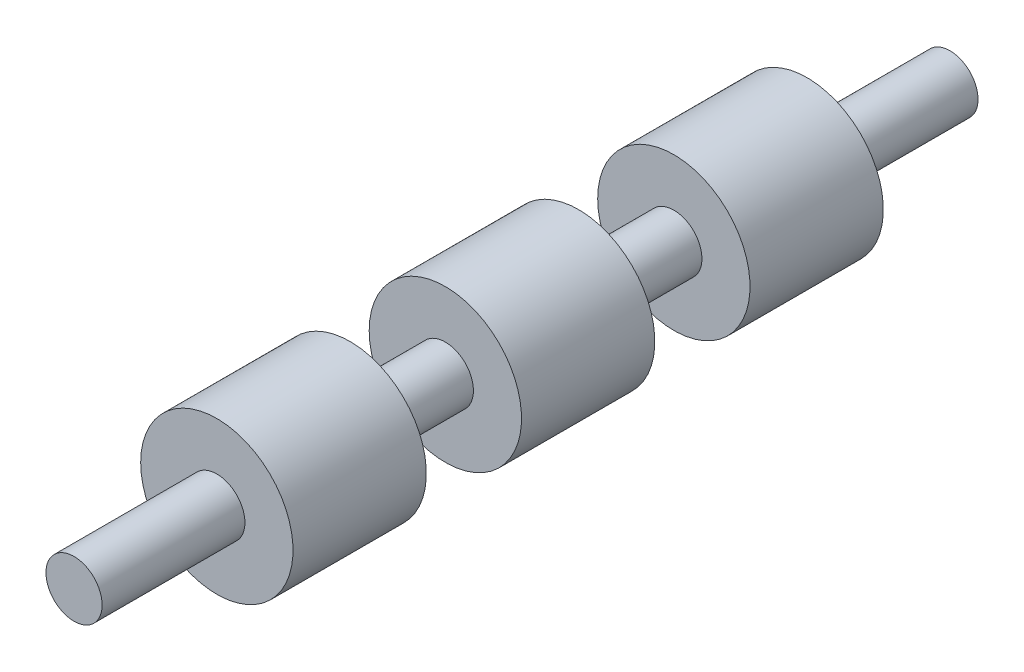
ISO-10303-21;
HEADER;
FILE_DESCRIPTION(('STEP AP214'),'2;1');
FILE_NAME('part.step','',(''),(''),'','','');
FILE_SCHEMA(('AUTOMOTIVE_DESIGN { 1 0 10303 214 1 1 1 1 }'));
ENDSEC;
DATA;
#1=APPLICATION_CONTEXT('core data for automotive mechanical design processes');
#2=APPLICATION_PROTOCOL_DEFINITION('international standard','automotive_design',2000,#1);
#3=PRODUCT_CONTEXT('',#1,'mechanical');
#4=PRODUCT('Part','Part','',(#3));
#5=PRODUCT_RELATED_PRODUCT_CATEGORY('part','',(#4));
#6=PRODUCT_DEFINITION_FORMATION('','',#4);
#7=PRODUCT_DEFINITION_CONTEXT('part definition',#1,'design');
#8=PRODUCT_DEFINITION('design','',#6,#7);
#9=PRODUCT_DEFINITION_SHAPE('','',#8);
#10=(LENGTH_UNIT() NAMED_UNIT(*) SI_UNIT(.MILLI.,.METRE.));
#11=(NAMED_UNIT(*) PLANE_ANGLE_UNIT() SI_UNIT($,.RADIAN.));
#12=(NAMED_UNIT(*) SI_UNIT($,.STERADIAN.) SOLID_ANGLE_UNIT());
#13=UNCERTAINTY_MEASURE_WITH_UNIT(LENGTH_MEASURE(1.E-05),#10,'distance_accuracy_value','');
#14=(GEOMETRIC_REPRESENTATION_CONTEXT(3) GLOBAL_UNCERTAINTY_ASSIGNED_CONTEXT((#13)) GLOBAL_UNIT_ASSIGNED_CONTEXT((#10,
#11,#12)) REPRESENTATION_CONTEXT('',''));
#15=CARTESIAN_POINT('',(0.,0.,0.));
#16=DIRECTION('',(0.,0.,1.));
#17=DIRECTION('',(1.,0.,0.));
#18=AXIS2_PLACEMENT_3D('',#15,#16,#17);
#19=CARTESIAN_POINT('',(0.,0.,15.));
#20=DIRECTION('',(0.,0.,-1.));
#21=DIRECTION('',(-1.,0.,0.));
#22=AXIS2_PLACEMENT_3D('',#19,#20,#21);
#23=CYLINDRICAL_SURFACE('',#22,2.95);
#24=CARTESIAN_POINT('',(0.,0.,15.));
#25=DIRECTION('',(0.,0.,1.));
#26=DIRECTION('',(1.,0.,0.));
#27=AXIS2_PLACEMENT_3D('',#24,#25,#26);
#28=CIRCLE('',#27,2.95);
#29=CARTESIAN_POINT('',(2.95,0.,15.));
#30=VERTEX_POINT('',#29);
#31=EDGE_CURVE('E70',#30,#30,#28,.T.);
#32=ORIENTED_EDGE('',*,*,#31,.F.);
#33=EDGE_LOOP('',(#32));
#34=FACE_BOUND('',#33,.T.);
#35=CARTESIAN_POINT('',(0.,0.,0.));
#36=DIRECTION('',(0.,0.,1.));
#37=DIRECTION('',(1.,0.,0.));
#38=AXIS2_PLACEMENT_3D('',#35,#36,#37);
#39=CIRCLE('',#38,2.95);
#40=CARTESIAN_POINT('',(2.95,0.,0.));
#41=VERTEX_POINT('',#40);
#42=EDGE_CURVE('E35',#41,#41,#39,.T.);
#43=ORIENTED_EDGE('',*,*,#42,.T.);
#44=EDGE_LOOP('',(#43));
#45=FACE_BOUND('',#44,.T.);
#46=ADVANCED_FACE('F32',(#34,#45),#23,.T.);
#47=CARTESIAN_POINT('',(0.,0.,15.));
#48=DIRECTION('',(0.,0.,1.));
#49=DIRECTION('',(1.,0.,0.));
#50=AXIS2_PLACEMENT_3D('',#47,#48,#49);
#51=PLANE('',#50);
#52=ORIENTED_EDGE('',*,*,#31,.T.);
#53=EDGE_LOOP('',(#52));
#54=FACE_BOUND('',#53,.T.);
#55=ADVANCED_FACE('F92',(#54),#51,.T.);
#56=CARTESIAN_POINT('',(0.,0.,-14.));
#57=DIRECTION('',(0.,0.,1.));
#58=DIRECTION('',(1.,0.,0.));
#59=AXIS2_PLACEMENT_3D('',#56,#57,#58);
#60=CYLINDRICAL_SURFACE('',#59,8.);
#61=CARTESIAN_POINT('',(0.,0.,-14.));
#62=DIRECTION('',(0.,0.,-1.));
#63=DIRECTION('',(-1.,0.,0.));
#64=AXIS2_PLACEMENT_3D('',#61,#62,#63);
#65=CIRCLE('',#64,8.);
#66=CARTESIAN_POINT('',(-8.,0.,-14.));
#67=VERTEX_POINT('',#66);
#68=EDGE_CURVE('E71',#67,#67,#65,.T.);
#69=ORIENTED_EDGE('',*,*,#68,.F.);
#70=EDGE_LOOP('',(#69));
#71=FACE_BOUND('',#70,.T.);
#72=CARTESIAN_POINT('',(0.,0.,0.));
#73=DIRECTION('',(0.,0.,-1.));
#74=DIRECTION('',(-1.,0.,0.));
#75=AXIS2_PLACEMENT_3D('',#72,#73,#74);
#76=CIRCLE('',#75,8.);
#77=CARTESIAN_POINT('',(-8.,0.,0.));
#78=VERTEX_POINT('',#77);
#79=EDGE_CURVE('E67',#78,#78,#76,.T.);
#80=ORIENTED_EDGE('',*,*,#79,.T.);
#81=EDGE_LOOP('',(#80));
#82=FACE_BOUND('',#81,.T.);
#83=ADVANCED_FACE('F90',(#71,#82),#60,.T.);
#84=CARTESIAN_POINT('',(0.,0.,-14.));
#85=DIRECTION('',(0.,0.,-1.));
#86=DIRECTION('',(-1.,0.,0.));
#87=AXIS2_PLACEMENT_3D('',#84,#85,#86);
#88=PLANE('',#87);
#89=CARTESIAN_POINT('',(0.,0.,-14.));
#90=DIRECTION('',(0.,0.,-1.));
#91=DIRECTION('',(-1.,0.,0.));
#92=AXIS2_PLACEMENT_3D('',#89,#90,#91);
#93=CIRCLE('',#92,2.95);
#94=CARTESIAN_POINT('',(-2.95,0.,-14.));
#95=VERTEX_POINT('',#94);
#96=EDGE_CURVE('E44',#95,#95,#93,.T.);
#97=ORIENTED_EDGE('',*,*,#96,.F.);
#98=EDGE_LOOP('',(#97));
#99=FACE_BOUND('',#98,.T.);
#100=ORIENTED_EDGE('',*,*,#68,.T.);
#101=EDGE_LOOP('',(#100));
#102=FACE_BOUND('',#101,.T.);
#103=ADVANCED_FACE('F86',(#99,#102),#88,.T.);
#104=CARTESIAN_POINT('',(0.,0.,0.));
#105=DIRECTION('',(0.,0.,-1.));
#106=DIRECTION('',(-1.,0.,0.));
#107=AXIS2_PLACEMENT_3D('',#104,#105,#106);
#108=PLANE('',#107);
#109=ORIENTED_EDGE('',*,*,#42,.F.);
#110=EDGE_LOOP('',(#109));
#111=FACE_BOUND('',#110,.T.);
#112=ORIENTED_EDGE('',*,*,#79,.F.);
#113=EDGE_LOOP('',(#112));
#114=FACE_BOUND('',#113,.T.);
#115=ADVANCED_FACE('F82',(#111,#114),#108,.F.);
#116=CARTESIAN_POINT('',(0.,0.,-24.));
#117=DIRECTION('',(0.,0.,1.));
#118=DIRECTION('',(1.,0.,0.));
#119=AXIS2_PLACEMENT_3D('',#116,#117,#118);
#120=CYLINDRICAL_SURFACE('',#119,2.95);
#121=CARTESIAN_POINT('',(0.,0.,-24.));
#122=DIRECTION('',(0.,0.,-1.));
#123=DIRECTION('',(-1.,0.,0.));
#124=AXIS2_PLACEMENT_3D('',#121,#122,#123);
#125=CIRCLE('',#124,2.95);
#126=CARTESIAN_POINT('',(-2.95,0.,-24.));
#127=VERTEX_POINT('',#126);
#128=EDGE_CURVE('E62',#127,#127,#125,.T.);
#129=ORIENTED_EDGE('',*,*,#128,.F.);
#130=EDGE_LOOP('',(#129));
#131=FACE_BOUND('',#130,.T.);
#132=ORIENTED_EDGE('',*,*,#96,.T.);
#133=EDGE_LOOP('',(#132));
#134=FACE_BOUND('',#133,.T.);
#135=ADVANCED_FACE('F85',(#131,#134),#120,.T.);
#136=CARTESIAN_POINT('',(0.,0.,-38.));
#137=DIRECTION('',(0.,0.,1.));
#138=DIRECTION('',(1.,0.,0.));
#139=AXIS2_PLACEMENT_3D('',#136,#137,#138);
#140=CYLINDRICAL_SURFACE('',#139,8.);
#141=CARTESIAN_POINT('',(0.,0.,-38.));
#142=DIRECTION('',(0.,0.,-1.));
#143=DIRECTION('',(-1.,0.,0.));
#144=AXIS2_PLACEMENT_3D('',#141,#142,#143);
#145=CIRCLE('',#144,8.);
#146=CARTESIAN_POINT('',(-8.,0.,-38.));
#147=VERTEX_POINT('',#146);
#148=EDGE_CURVE('E59',#147,#147,#145,.T.);
#149=ORIENTED_EDGE('',*,*,#148,.F.);
#150=EDGE_LOOP('',(#149));
#151=FACE_BOUND('',#150,.T.);
#152=CARTESIAN_POINT('',(0.,0.,-24.));
#153=DIRECTION('',(0.,0.,-1.));
#154=DIRECTION('',(-1.,0.,0.));
#155=AXIS2_PLACEMENT_3D('',#152,#153,#154);
#156=CIRCLE('',#155,8.);
#157=CARTESIAN_POINT('',(-8.,0.,-24.));
#158=VERTEX_POINT('',#157);
#159=EDGE_CURVE('E57',#158,#158,#156,.T.);
#160=ORIENTED_EDGE('',*,*,#159,.T.);
#161=EDGE_LOOP('',(#160));
#162=FACE_BOUND('',#161,.T.);
#163=ADVANCED_FACE('F135',(#151,#162),#140,.T.);
#164=CARTESIAN_POINT('',(0.,0.,-38.));
#165=DIRECTION('',(0.,0.,-1.));
#166=DIRECTION('',(-1.,0.,0.));
#167=AXIS2_PLACEMENT_3D('',#164,#165,#166);
#168=PLANE('',#167);
#169=CARTESIAN_POINT('',(0.,0.,-38.));
#170=DIRECTION('',(0.,0.,-1.));
#171=DIRECTION('',(-1.,0.,0.));
#172=AXIS2_PLACEMENT_3D('',#169,#170,#171);
#173=CIRCLE('',#172,2.95);
#174=CARTESIAN_POINT('',(-2.95,0.,-38.));
#175=VERTEX_POINT('',#174);
#176=EDGE_CURVE('E39',#175,#175,#173,.T.);
#177=ORIENTED_EDGE('',*,*,#176,.F.);
#178=EDGE_LOOP('',(#177));
#179=FACE_BOUND('',#178,.T.);
#180=ORIENTED_EDGE('',*,*,#148,.T.);
#181=EDGE_LOOP('',(#180));
#182=FACE_BOUND('',#181,.T.);
#183=ADVANCED_FACE('F145',(#179,#182),#168,.T.);
#184=CARTESIAN_POINT('',(0.,0.,-24.));
#185=DIRECTION('',(0.,0.,-1.));
#186=DIRECTION('',(-1.,0.,0.));
#187=AXIS2_PLACEMENT_3D('',#184,#185,#186);
#188=PLANE('',#187);
#189=ORIENTED_EDGE('',*,*,#128,.T.);
#190=EDGE_LOOP('',(#189));
#191=FACE_BOUND('',#190,.T.);
#192=ORIENTED_EDGE('',*,*,#159,.F.);
#193=EDGE_LOOP('',(#192));
#194=FACE_BOUND('',#193,.T.);
#195=ADVANCED_FACE('F153',(#191,#194),#188,.F.);
#196=CARTESIAN_POINT('',(0.,0.,-48.));
#197=DIRECTION('',(0.,0.,1.));
#198=DIRECTION('',(1.,0.,0.));
#199=AXIS2_PLACEMENT_3D('',#196,#197,#198);
#200=CYLINDRICAL_SURFACE('',#199,2.95);
#201=CARTESIAN_POINT('',(0.,0.,-48.));
#202=DIRECTION('',(0.,0.,-1.));
#203=DIRECTION('',(-1.,0.,0.));
#204=AXIS2_PLACEMENT_3D('',#201,#202,#203);
#205=CIRCLE('',#204,2.95);
#206=CARTESIAN_POINT('',(-2.95,0.,-48.));
#207=VERTEX_POINT('',#206);
#208=EDGE_CURVE('E52',#207,#207,#205,.T.);
#209=ORIENTED_EDGE('',*,*,#208,.F.);
#210=EDGE_LOOP('',(#209));
#211=FACE_BOUND('',#210,.T.);
#212=ORIENTED_EDGE('',*,*,#176,.T.);
#213=EDGE_LOOP('',(#212));
#214=FACE_BOUND('',#213,.T.);
#215=ADVANCED_FACE('F158',(#211,#214),#200,.T.);
#216=CARTESIAN_POINT('',(0.,0.,-62.));
#217=DIRECTION('',(0.,0.,1.));
#218=DIRECTION('',(1.,0.,0.));
#219=AXIS2_PLACEMENT_3D('',#216,#217,#218);
#220=CYLINDRICAL_SURFACE('',#219,8.);
#221=CARTESIAN_POINT('',(0.,0.,-62.));
#222=DIRECTION('',(0.,0.,-1.));
#223=DIRECTION('',(-1.,0.,0.));
#224=AXIS2_PLACEMENT_3D('',#221,#222,#223);
#225=CIRCLE('',#224,8.);
#226=CARTESIAN_POINT('',(-8.,0.,-62.));
#227=VERTEX_POINT('',#226);
#228=EDGE_CURVE('E49',#227,#227,#225,.T.);
#229=ORIENTED_EDGE('',*,*,#228,.F.);
#230=EDGE_LOOP('',(#229));
#231=FACE_BOUND('',#230,.T.);
#232=CARTESIAN_POINT('',(0.,0.,-48.));
#233=DIRECTION('',(0.,0.,-1.));
#234=DIRECTION('',(-1.,0.,0.));
#235=AXIS2_PLACEMENT_3D('',#232,#233,#234);
#236=CIRCLE('',#235,8.);
#237=CARTESIAN_POINT('',(-8.,0.,-48.));
#238=VERTEX_POINT('',#237);
#239=EDGE_CURVE('E53',#238,#238,#236,.T.);
#240=ORIENTED_EDGE('',*,*,#239,.T.);
#241=EDGE_LOOP('',(#240));
#242=FACE_BOUND('',#241,.T.);
#243=ADVANCED_FACE('F175',(#231,#242),#220,.T.);
#244=CARTESIAN_POINT('',(0.,0.,-62.));
#245=DIRECTION('',(0.,0.,-1.));
#246=DIRECTION('',(-1.,0.,0.));
#247=AXIS2_PLACEMENT_3D('',#244,#245,#246);
#248=PLANE('',#247);
#249=CARTESIAN_POINT('',(0.,0.,-62.));
#250=DIRECTION('',(0.,0.,-1.));
#251=DIRECTION('',(-1.,0.,0.));
#252=AXIS2_PLACEMENT_3D('',#249,#250,#251);
#253=CIRCLE('',#252,2.95);
#254=CARTESIAN_POINT('',(-2.95,0.,-62.));
#255=VERTEX_POINT('',#254);
#256=EDGE_CURVE('E10',#255,#255,#253,.T.);
#257=ORIENTED_EDGE('',*,*,#256,.F.);
#258=EDGE_LOOP('',(#257));
#259=FACE_BOUND('',#258,.T.);
#260=ORIENTED_EDGE('',*,*,#228,.T.);
#261=EDGE_LOOP('',(#260));
#262=FACE_BOUND('',#261,.T.);
#263=ADVANCED_FACE('F185',(#259,#262),#248,.T.);
#264=CARTESIAN_POINT('',(0.,0.,-48.));
#265=DIRECTION('',(0.,0.,-1.));
#266=DIRECTION('',(-1.,0.,0.));
#267=AXIS2_PLACEMENT_3D('',#264,#265,#266);
#268=PLANE('',#267);
#269=ORIENTED_EDGE('',*,*,#208,.T.);
#270=EDGE_LOOP('',(#269));
#271=FACE_BOUND('',#270,.T.);
#272=ORIENTED_EDGE('',*,*,#239,.F.);
#273=EDGE_LOOP('',(#272));
#274=FACE_BOUND('',#273,.T.);
#275=ADVANCED_FACE('F193',(#271,#274),#268,.F.);
#276=CARTESIAN_POINT('',(0.,0.,-77.));
#277=DIRECTION('',(0.,0.,1.));
#278=DIRECTION('',(1.,0.,0.));
#279=AXIS2_PLACEMENT_3D('',#276,#277,#278);
#280=CYLINDRICAL_SURFACE('',#279,2.95);
#281=CARTESIAN_POINT('',(0.,0.,-77.));
#282=DIRECTION('',(0.,0.,-1.));
#283=DIRECTION('',(-1.,0.,0.));
#284=AXIS2_PLACEMENT_3D('',#281,#282,#283);
#285=CIRCLE('',#284,2.95);
#286=CARTESIAN_POINT('',(-2.95,0.,-77.));
#287=VERTEX_POINT('',#286);
#288=EDGE_CURVE('E48',#287,#287,#285,.T.);
#289=ORIENTED_EDGE('',*,*,#288,.F.);
#290=EDGE_LOOP('',(#289));
#291=FACE_BOUND('',#290,.T.);
#292=ORIENTED_EDGE('',*,*,#256,.T.);
#293=EDGE_LOOP('',(#292));
#294=FACE_BOUND('',#293,.T.);
#295=ADVANCED_FACE('F198',(#291,#294),#280,.T.);
#296=CARTESIAN_POINT('',(0.,0.,-77.));
#297=DIRECTION('',(0.,0.,-1.));
#298=DIRECTION('',(-1.,0.,0.));
#299=AXIS2_PLACEMENT_3D('',#296,#297,#298);
#300=PLANE('',#299);
#301=ORIENTED_EDGE('',*,*,#288,.T.);
#302=EDGE_LOOP('',(#301));
#303=FACE_BOUND('',#302,.T.);
#304=ADVANCED_FACE('F215',(#303),#300,.T.);
#305=CLOSED_SHELL('',(#46,#55,#83,#103,#115,#135,#163,#183,#195,#215,#243,#263,#275,#295,#304));
#306=MANIFOLD_SOLID_BREP('B2',#305);
#307=ADVANCED_BREP_SHAPE_REPRESENTATION('',(#18,#306),#14);
#308=SHAPE_DEFINITION_REPRESENTATION(#9,#307);
ENDSEC;
END-ISO-10303-21;
